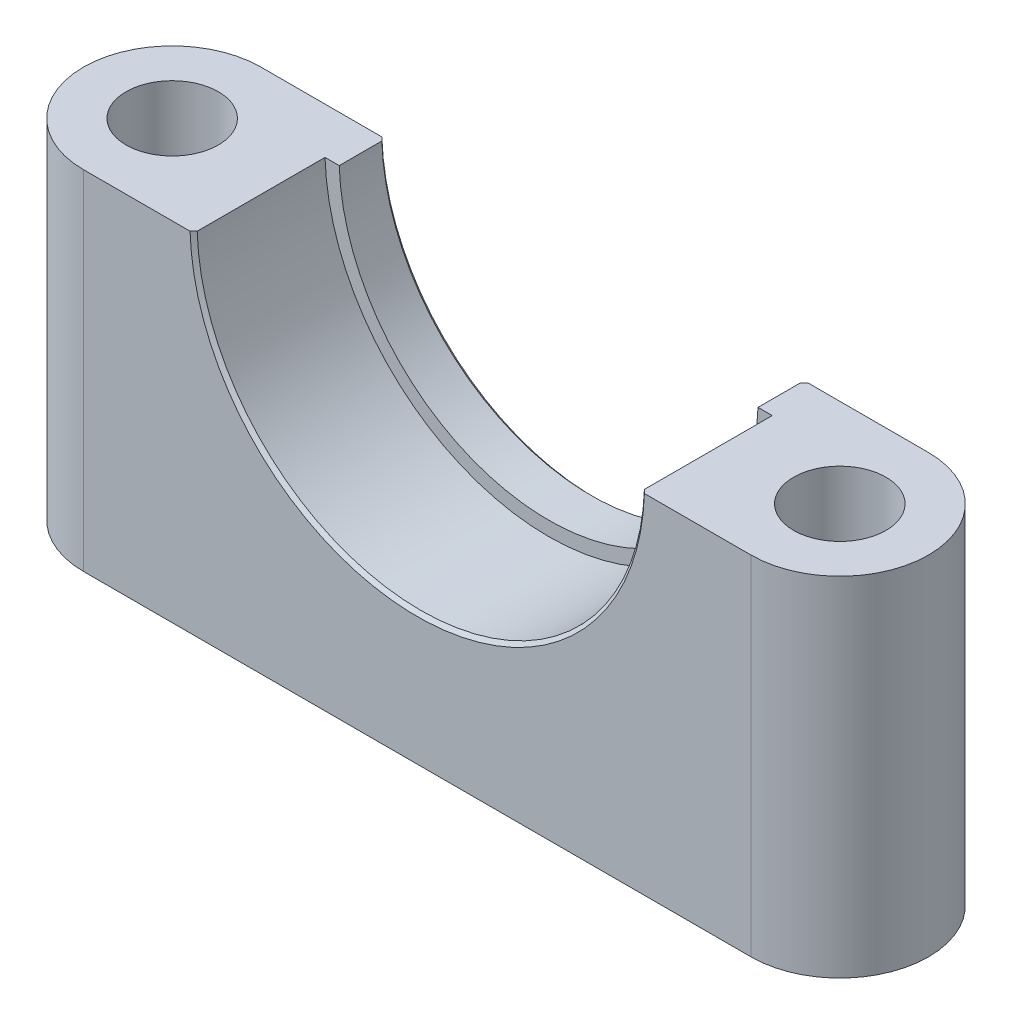
ISO-10303-21;
HEADER;
FILE_DESCRIPTION(('STEP AP214'),'2;1');
FILE_NAME('part.step','',(''),(''),'','','');
FILE_SCHEMA(('AUTOMOTIVE_DESIGN { 1 0 10303 214 1 1 1 1 }'));
ENDSEC;
DATA;
#1=APPLICATION_CONTEXT('core data for automotive mechanical design processes');
#2=APPLICATION_PROTOCOL_DEFINITION('international standard','automotive_design',2000,#1);
#3=PRODUCT_CONTEXT('',#1,'mechanical');
#4=PRODUCT('Part','Part','',(#3));
#5=PRODUCT_RELATED_PRODUCT_CATEGORY('part','',(#4));
#6=PRODUCT_DEFINITION_FORMATION('','',#4);
#7=PRODUCT_DEFINITION_CONTEXT('part definition',#1,'design');
#8=PRODUCT_DEFINITION('design','',#6,#7);
#9=PRODUCT_DEFINITION_SHAPE('','',#8);
#10=(LENGTH_UNIT() NAMED_UNIT(*) SI_UNIT(.MILLI.,.METRE.));
#11=(NAMED_UNIT(*) PLANE_ANGLE_UNIT() SI_UNIT($,.RADIAN.));
#12=(NAMED_UNIT(*) SI_UNIT($,.STERADIAN.) SOLID_ANGLE_UNIT());
#13=UNCERTAINTY_MEASURE_WITH_UNIT(LENGTH_MEASURE(1.E-05),#10,'distance_accuracy_value','');
#14=(GEOMETRIC_REPRESENTATION_CONTEXT(3) GLOBAL_UNCERTAINTY_ASSIGNED_CONTEXT((#13)) GLOBAL_UNIT_ASSIGNED_CONTEXT((#10,
#11,#12)) REPRESENTATION_CONTEXT('',''));
#15=CARTESIAN_POINT('',(0.,0.,0.));
#16=DIRECTION('',(0.,0.,1.));
#17=DIRECTION('',(1.,0.,0.));
#18=AXIS2_PLACEMENT_3D('',#15,#16,#17);
#19=CARTESIAN_POINT('',(-23.876,24.892,0.));
#20=DIRECTION('',(0.,1.,0.));
#21=DIRECTION('',(0.,0.,1.));
#22=AXIS2_PLACEMENT_3D('',#19,#20,#21);
#23=PLANE('',#22);
#24=DIRECTION('',(0.,0.,1.));
#25=VECTOR('',#24,1.);
#26=CARTESIAN_POINT('',(-14.9773873556105,24.892,-20.828));
#27=LINE('',#26,#25);
#28=CARTESIAN_POINT('',(-14.9773873556105,24.892,-6.09600000000004));
#29=VERTEX_POINT('',#28);
#30=CARTESIAN_POINT('',(-14.9773873556105,24.892,-3.048));
#31=VERTEX_POINT('',#30);
#32=EDGE_CURVE('E120',#29,#31,#27,.T.);
#33=ORIENTED_EDGE('',*,*,#32,.F.);
#34=CARTESIAN_POINT('',(-14.9773873556105,24.892,-6.09600000000004));
#35=CARTESIAN_POINT('',(-15.0197448275827,24.892,-6.1383331320079));
#36=CARTESIAN_POINT('',(-15.0621021989492,24.892,-6.1806663646785));
#37=CARTESIAN_POINT('',(-15.1468167404703,24.892,-6.26533303134515));
#38=CARTESIAN_POINT('',(-15.1891739106251,24.892,-6.30766646534121));
#39=CARTESIAN_POINT('',(-15.231530980174,24.892,-6.35));
#40=B_SPLINE_CURVE_WITH_KNOTS('',3,(#34,#35,#36,#37,#38,#39),.UNSPECIFIED.,.F.,.F.,(4,2,4),(0.,
0.17965590854951,0.359311817099004),.UNSPECIFIED.);
#41=CARTESIAN_POINT('',(-15.231530980174,24.892,-6.35));
#42=VERTEX_POINT('',#41);
#43=EDGE_CURVE('E178',#29,#42,#40,.T.);
#44=ORIENTED_EDGE('',*,*,#43,.T.);
#45=DIRECTION('',(-1.,0.,0.));
#46=VECTOR('',#45,1.);
#47=CARTESIAN_POINT('',(-23.876,24.892,-6.35));
#48=LINE('',#47,#46);
#49=CARTESIAN_POINT('',(-23.876,24.892,-6.35));
#50=VERTEX_POINT('',#49);
#51=EDGE_CURVE('E242',#42,#50,#48,.T.);
#52=ORIENTED_EDGE('',*,*,#51,.T.);
#53=CARTESIAN_POINT('',(-23.876,24.892,0.));
#54=DIRECTION('',(0.,1.,0.));
#55=DIRECTION('',(0.,0.,1.));
#56=AXIS2_PLACEMENT_3D('',#53,#54,#55);
#57=CIRCLE('',#56,6.35);
#58=CARTESIAN_POINT('',(-23.876,24.892,6.35));
#59=VERTEX_POINT('',#58);
#60=EDGE_CURVE('E233',#50,#59,#57,.T.);
#61=ORIENTED_EDGE('',*,*,#60,.T.);
#62=DIRECTION('',(1.,0.,0.));
#63=VECTOR('',#62,1.);
#64=CARTESIAN_POINT('',(-23.876,24.892,6.35));
#65=LINE('',#64,#63);
#66=CARTESIAN_POINT('',(-16.248060561187,24.892,6.35));
#67=VERTEX_POINT('',#66);
#68=EDGE_CURVE('E238',#59,#67,#65,.T.);
#69=ORIENTED_EDGE('',*,*,#68,.T.);
#70=CARTESIAN_POINT('',(-16.248060561187,24.892,6.35));
#71=CARTESIAN_POINT('',(-16.2057063790463,24.892,6.3076665010764));
#72=CARTESIAN_POINT('',(-16.1633521141515,24.892,6.26533308494794));
#73=CARTESIAN_POINT('',(-16.0786434188539,24.892,6.18066641828127));
#74=CARTESIAN_POINT('',(-16.036288988451,24.892,6.13833316774306));
#75=CARTESIAN_POINT('',(-15.9939344752941,24.892,6.09599999999998));
#76=B_SPLINE_CURVE_WITH_KNOTS('',3,(#70,#71,#72,#73,#74,#75),.UNSPECIFIED.,.F.,.F.,(4,2,4),(0.,
0.179649706047461,0.359299412094932),.UNSPECIFIED.);
#77=CARTESIAN_POINT('',(-15.9939344752941,24.892,6.09599999999998));
#78=VERTEX_POINT('',#77);
#79=EDGE_CURVE('E52',#67,#78,#76,.T.);
#80=ORIENTED_EDGE('',*,*,#79,.T.);
#81=DIRECTION('',(0.,0.,1.));
#82=VECTOR('',#81,1.);
#83=CARTESIAN_POINT('',(-15.9939344752941,24.892,-51.6104908501885));
#84=LINE('',#83,#82);
#85=CARTESIAN_POINT('',(-15.9939344752941,24.892,-3.04800000000001));
#86=VERTEX_POINT('',#85);
#87=EDGE_CURVE('E225',#86,#78,#84,.T.);
#88=ORIENTED_EDGE('',*,*,#87,.F.);
#89=DIRECTION('',(1.,0.,0.));
#90=VECTOR('',#89,1.);
#91=CARTESIAN_POINT('',(-23.876,24.892,-3.048));
#92=LINE('',#91,#90);
#93=EDGE_CURVE('E138',#86,#31,#92,.T.);
#94=ORIENTED_EDGE('',*,*,#93,.T.);
#95=EDGE_LOOP('',(#33,#44,#52,#61,#69,#80,#88,#94));
#96=FACE_BOUND('',#95,.T.);
#97=CARTESIAN_POINT('',(-23.876,24.892,0.));
#98=DIRECTION('',(0.,1.,0.));
#99=DIRECTION('',(0.,0.,1.));
#100=AXIS2_PLACEMENT_3D('',#97,#98,#99);
#101=CIRCLE('',#100,3.302);
#102=CARTESIAN_POINT('',(-23.876,24.892,3.302));
#103=VERTEX_POINT('',#102);
#104=EDGE_CURVE('E216',#103,#103,#101,.T.);
#105=ORIENTED_EDGE('',*,*,#104,.F.);
#106=EDGE_LOOP('',(#105));
#107=FACE_BOUND('',#106,.T.);
#108=ADVANCED_FACE('F36',(#96,#107),#23,.T.);
#109=CARTESIAN_POINT('',(23.876,24.892,-6.35000000000001));
#110=VERTEX_POINT('',#109);
#111=CARTESIAN_POINT('',(15.231530980174,24.892,-6.35000000000001));
#112=VERTEX_POINT('',#111);
#113=EDGE_CURVE('E243',#110,#112,#48,.T.);
#114=ORIENTED_EDGE('',*,*,#113,.T.);
#115=CARTESIAN_POINT('',(15.231530980174,24.892,-6.35000000000001));
#116=CARTESIAN_POINT('',(15.1891739106251,24.892,-6.30766646534121));
#117=CARTESIAN_POINT('',(15.1468167404703,24.892,-6.26533303134515));
#118=CARTESIAN_POINT('',(15.0621021989492,24.892,-6.1806663646785));
#119=CARTESIAN_POINT('',(15.0197448275827,24.892,-6.1383331320079));
#120=CARTESIAN_POINT('',(14.9773873556105,24.892,-6.09600000000004));
#121=B_SPLINE_CURVE_WITH_KNOTS('',3,(#115,#116,#117,#118,#119,#120),.UNSPECIFIED.,.F.,.F.,(4,2,
4),(0.,0.179655908549496,0.359311817099008),.UNSPECIFIED.);
#122=CARTESIAN_POINT('',(14.9773873556105,24.892,-6.09600000000004));
#123=VERTEX_POINT('',#122);
#124=EDGE_CURVE('E133',#112,#123,#121,.T.);
#125=ORIENTED_EDGE('',*,*,#124,.T.);
#126=DIRECTION('',(0.,0.,1.));
#127=VECTOR('',#126,1.);
#128=CARTESIAN_POINT('',(14.9773873556105,24.892,-20.828));
#129=LINE('',#128,#127);
#130=CARTESIAN_POINT('',(14.9773873556105,24.892,-3.048));
#131=VERTEX_POINT('',#130);
#132=EDGE_CURVE('E117',#131,#123,#129,.F.);
#133=ORIENTED_EDGE('',*,*,#132,.F.);
#134=CARTESIAN_POINT('',(15.9939344752941,24.892,-3.04800000000001));
#135=VERTEX_POINT('',#134);
#136=EDGE_CURVE('E131',#131,#135,#92,.T.);
#137=ORIENTED_EDGE('',*,*,#136,.T.);
#138=DIRECTION('',(0.,0.,1.));
#139=VECTOR('',#138,1.);
#140=CARTESIAN_POINT('',(15.9939344752941,24.892,-51.6104908501885));
#141=LINE('',#140,#139);
#142=CARTESIAN_POINT('',(15.9939344752941,24.892,6.09599999999998));
#143=VERTEX_POINT('',#142);
#144=EDGE_CURVE('E276',#143,#135,#141,.F.);
#145=ORIENTED_EDGE('',*,*,#144,.F.);
#146=CARTESIAN_POINT('',(15.9939344752941,24.892,6.09599999999998));
#147=CARTESIAN_POINT('',(16.036288988451,24.892,6.13833316774306));
#148=CARTESIAN_POINT('',(16.0786434188539,24.892,6.18066641828127));
#149=CARTESIAN_POINT('',(16.1633521141515,24.892,6.26533308494794));
#150=CARTESIAN_POINT('',(16.2057063790463,24.892,6.3076665010764));
#151=CARTESIAN_POINT('',(16.248060561187,24.892,6.35));
#152=B_SPLINE_CURVE_WITH_KNOTS('',3,(#146,#147,#148,#149,#150,#151),.UNSPECIFIED.,.F.,.F.,(4,2,
4),(0.,0.179649706047471,0.359299412094929),.UNSPECIFIED.);
#153=CARTESIAN_POINT('',(16.248060561187,24.892,6.34999999999999));
#154=VERTEX_POINT('',#153);
#155=EDGE_CURVE('E149',#143,#154,#152,.T.);
#156=ORIENTED_EDGE('',*,*,#155,.T.);
#157=CARTESIAN_POINT('',(23.876,24.892,6.35));
#158=VERTEX_POINT('',#157);
#159=EDGE_CURVE('E236',#154,#158,#65,.T.);
#160=ORIENTED_EDGE('',*,*,#159,.T.);
#161=CARTESIAN_POINT('',(23.876,24.892,0.));
#162=DIRECTION('',(0.,1.,0.));
#163=DIRECTION('',(0.,0.,1.));
#164=AXIS2_PLACEMENT_3D('',#161,#162,#163);
#165=CIRCLE('',#164,6.35);
#166=EDGE_CURVE('E240',#158,#110,#165,.T.);
#167=ORIENTED_EDGE('',*,*,#166,.T.);
#168=EDGE_LOOP('',(#114,#125,#133,#137,#145,#156,#160,#167));
#169=FACE_BOUND('',#168,.T.);
#170=CARTESIAN_POINT('',(23.876,24.892,0.));
#171=DIRECTION('',(0.,1.,0.));
#172=DIRECTION('',(0.,0.,1.));
#173=AXIS2_PLACEMENT_3D('',#170,#171,#172);
#174=CIRCLE('',#173,3.302);
#175=CARTESIAN_POINT('',(23.876,24.892,3.302));
#176=VERTEX_POINT('',#175);
#177=EDGE_CURVE('E222',#176,#176,#174,.T.);
#178=ORIENTED_EDGE('',*,*,#177,.F.);
#179=EDGE_LOOP('',(#178));
#180=FACE_BOUND('',#179,.T.);
#181=ADVANCED_FACE('F128',(#169,#180),#23,.T.);
#182=CARTESIAN_POINT('',(-23.876,0.,0.));
#183=DIRECTION('',(0.,1.,0.));
#184=DIRECTION('',(0.,0.,1.));
#185=AXIS2_PLACEMENT_3D('',#182,#183,#184);
#186=PLANE('',#185);
#187=CARTESIAN_POINT('',(-23.876,0.,0.));
#188=DIRECTION('',(0.,1.,0.));
#189=DIRECTION('',(0.,0.,1.));
#190=AXIS2_PLACEMENT_3D('',#187,#188,#189);
#191=CIRCLE('',#190,6.35);
#192=CARTESIAN_POINT('',(-23.876,0.,-6.35));
#193=VERTEX_POINT('',#192);
#194=CARTESIAN_POINT('',(-23.876,0.,6.35));
#195=VERTEX_POINT('',#194);
#196=EDGE_CURVE('E231',#193,#195,#191,.T.);
#197=ORIENTED_EDGE('',*,*,#196,.F.);
#198=DIRECTION('',(-1.,0.,0.));
#199=VECTOR('',#198,1.);
#200=CARTESIAN_POINT('',(-23.876,0.,-6.35));
#201=LINE('',#200,#199);
#202=CARTESIAN_POINT('',(23.876,0.,-6.35000000000001));
#203=VERTEX_POINT('',#202);
#204=EDGE_CURVE('E237',#203,#193,#201,.T.);
#205=ORIENTED_EDGE('',*,*,#204,.F.);
#206=CARTESIAN_POINT('',(23.876,0.,0.));
#207=DIRECTION('',(0.,1.,0.));
#208=DIRECTION('',(0.,0.,1.));
#209=AXIS2_PLACEMENT_3D('',#206,#207,#208);
#210=CIRCLE('',#209,6.35);
#211=CARTESIAN_POINT('',(23.876,0.,6.35));
#212=VERTEX_POINT('',#211);
#213=EDGE_CURVE('E250',#212,#203,#210,.T.);
#214=ORIENTED_EDGE('',*,*,#213,.F.);
#215=DIRECTION('',(1.,0.,0.));
#216=VECTOR('',#215,1.);
#217=CARTESIAN_POINT('',(-23.876,0.,6.35));
#218=LINE('',#217,#216);
#219=EDGE_CURVE('E248',#195,#212,#218,.T.);
#220=ORIENTED_EDGE('',*,*,#219,.F.);
#221=EDGE_LOOP('',(#197,#205,#214,#220));
#222=FACE_BOUND('',#221,.T.);
#223=CARTESIAN_POINT('',(23.876,0.,0.));
#224=DIRECTION('',(0.,1.,0.));
#225=DIRECTION('',(0.,0.,1.));
#226=AXIS2_PLACEMENT_3D('',#223,#224,#225);
#227=CIRCLE('',#226,3.302);
#228=CARTESIAN_POINT('',(23.876,0.,3.302));
#229=VERTEX_POINT('',#228);
#230=EDGE_CURVE('E218',#229,#229,#227,.T.);
#231=ORIENTED_EDGE('',*,*,#230,.T.);
#232=EDGE_LOOP('',(#231));
#233=FACE_BOUND('',#232,.T.);
#234=CARTESIAN_POINT('',(-23.876,0.,0.));
#235=DIRECTION('',(0.,1.,0.));
#236=DIRECTION('',(0.,0.,1.));
#237=AXIS2_PLACEMENT_3D('',#234,#235,#236);
#238=CIRCLE('',#237,3.302);
#239=CARTESIAN_POINT('',(-23.876,0.,3.302));
#240=VERTEX_POINT('',#239);
#241=EDGE_CURVE('E219',#240,#240,#238,.T.);
#242=ORIENTED_EDGE('',*,*,#241,.T.);
#243=EDGE_LOOP('',(#242));
#244=FACE_BOUND('',#243,.T.);
#245=ADVANCED_FACE('F165',(#222,#233,#244),#186,.F.);
#246=CARTESIAN_POINT('',(-23.876,24.892,0.));
#247=DIRECTION('',(0.,-1.,0.));
#248=DIRECTION('',(0.,0.,-1.));
#249=AXIS2_PLACEMENT_3D('',#246,#247,#248);
#250=CYLINDRICAL_SURFACE('',#249,6.35);
#251=ORIENTED_EDGE('',*,*,#196,.T.);
#252=DIRECTION('',(0.,-1.,0.));
#253=VECTOR('',#252,1.);
#254=CARTESIAN_POINT('',(-23.876,24.892,6.35));
#255=LINE('',#254,#253);
#256=EDGE_CURVE('E139',#59,#195,#255,.T.);
#257=ORIENTED_EDGE('',*,*,#256,.F.);
#258=ORIENTED_EDGE('',*,*,#60,.F.);
#259=DIRECTION('',(0.,-1.,0.));
#260=VECTOR('',#259,1.);
#261=CARTESIAN_POINT('',(-23.876,24.892,-6.35));
#262=LINE('',#261,#260);
#263=EDGE_CURVE('E245',#50,#193,#262,.T.);
#264=ORIENTED_EDGE('',*,*,#263,.T.);
#265=EDGE_LOOP('',(#251,#257,#258,#264));
#266=FACE_BOUND('',#265,.T.);
#267=ADVANCED_FACE('F189',(#266),#250,.T.);
#268=CARTESIAN_POINT('',(-23.876,24.892,6.35));
#269=DIRECTION('',(0.,0.,-1.));
#270=DIRECTION('',(-1.,0.,0.));
#271=AXIS2_PLACEMENT_3D('',#268,#269,#270);
#272=PLANE('',#271);
#273=ORIENTED_EDGE('',*,*,#159,.F.);
#274=CARTESIAN_POINT('',(0.,25.4,6.35));
#275=DIRECTION('',(0.,0.,-1.));
#276=DIRECTION('',(-1.,0.,0.));
#277=AXIS2_PLACEMENT_3D('',#274,#275,#276);
#278=CIRCLE('',#277,16.256);
#279=EDGE_CURVE('E12',#154,#67,#278,.T.);
#280=ORIENTED_EDGE('',*,*,#279,.T.);
#281=ORIENTED_EDGE('',*,*,#68,.F.);
#282=ORIENTED_EDGE('',*,*,#256,.T.);
#283=ORIENTED_EDGE('',*,*,#219,.T.);
#284=DIRECTION('',(0.,-1.,0.));
#285=VECTOR('',#284,1.);
#286=CARTESIAN_POINT('',(23.876,24.892,6.35));
#287=LINE('',#286,#285);
#288=EDGE_CURVE('E143',#158,#212,#287,.T.);
#289=ORIENTED_EDGE('',*,*,#288,.F.);
#290=EDGE_LOOP('',(#273,#280,#281,#282,#283,#289));
#291=FACE_BOUND('',#290,.T.);
#292=ADVANCED_FACE('F193',(#291),#272,.F.);
#293=CARTESIAN_POINT('',(23.876,24.892,0.));
#294=DIRECTION('',(0.,-1.,0.));
#295=DIRECTION('',(0.,0.,-1.));
#296=AXIS2_PLACEMENT_3D('',#293,#294,#295);
#297=CYLINDRICAL_SURFACE('',#296,6.35);
#298=ORIENTED_EDGE('',*,*,#213,.T.);
#299=DIRECTION('',(0.,-1.,0.));
#300=VECTOR('',#299,1.);
#301=CARTESIAN_POINT('',(23.876,24.892,-6.35000000000001));
#302=LINE('',#301,#300);
#303=EDGE_CURVE('E255',#110,#203,#302,.T.);
#304=ORIENTED_EDGE('',*,*,#303,.F.);
#305=ORIENTED_EDGE('',*,*,#166,.F.);
#306=ORIENTED_EDGE('',*,*,#288,.T.);
#307=EDGE_LOOP('',(#298,#304,#305,#306));
#308=FACE_BOUND('',#307,.T.);
#309=ADVANCED_FACE('F197',(#308),#297,.T.);
#310=CARTESIAN_POINT('',(-23.876,24.892,-6.35));
#311=DIRECTION('',(0.,0.,1.));
#312=DIRECTION('',(1.,0.,0.));
#313=AXIS2_PLACEMENT_3D('',#310,#311,#312);
#314=PLANE('',#313);
#315=ORIENTED_EDGE('',*,*,#51,.F.);
#316=CARTESIAN_POINT('',(0.,25.4,-6.35));
#317=DIRECTION('',(0.,0.,1.));
#318=DIRECTION('',(1.,0.,0.));
#319=AXIS2_PLACEMENT_3D('',#316,#317,#318);
#320=CIRCLE('',#319,15.24);
#321=EDGE_CURVE('E141',#42,#112,#320,.T.);
#322=ORIENTED_EDGE('',*,*,#321,.T.);
#323=ORIENTED_EDGE('',*,*,#113,.F.);
#324=ORIENTED_EDGE('',*,*,#303,.T.);
#325=ORIENTED_EDGE('',*,*,#204,.T.);
#326=ORIENTED_EDGE('',*,*,#263,.F.);
#327=EDGE_LOOP('',(#315,#322,#323,#324,#325,#326));
#328=FACE_BOUND('',#327,.T.);
#329=ADVANCED_FACE('F199',(#328),#314,.F.);
#330=CARTESIAN_POINT('',(23.876,24.892,0.));
#331=DIRECTION('',(0.,-1.,0.));
#332=DIRECTION('',(0.,0.,-1.));
#333=AXIS2_PLACEMENT_3D('',#330,#331,#332);
#334=CYLINDRICAL_SURFACE('',#333,3.302);
#335=ORIENTED_EDGE('',*,*,#177,.T.);
#336=EDGE_LOOP('',(#335));
#337=FACE_BOUND('',#336,.T.);
#338=ORIENTED_EDGE('',*,*,#230,.F.);
#339=EDGE_LOOP('',(#338));
#340=FACE_BOUND('',#339,.T.);
#341=ADVANCED_FACE('F166',(#337,#340),#334,.F.);
#342=CARTESIAN_POINT('',(-23.876,24.892,0.));
#343=DIRECTION('',(0.,-1.,0.));
#344=DIRECTION('',(0.,0.,-1.));
#345=AXIS2_PLACEMENT_3D('',#342,#343,#344);
#346=CYLINDRICAL_SURFACE('',#345,3.302);
#347=ORIENTED_EDGE('',*,*,#104,.T.);
#348=EDGE_LOOP('',(#347));
#349=FACE_BOUND('',#348,.T.);
#350=ORIENTED_EDGE('',*,*,#241,.F.);
#351=EDGE_LOOP('',(#350));
#352=FACE_BOUND('',#351,.T.);
#353=ADVANCED_FACE('F206',(#349,#352),#346,.F.);
#354=CARTESIAN_POINT('',(0.,25.4,-51.6104908501885));
#355=DIRECTION('',(0.,0.,1.));
#356=DIRECTION('',(1.,0.,0.));
#357=AXIS2_PLACEMENT_3D('',#354,#355,#356);
#358=CYLINDRICAL_SURFACE('',#357,16.002);
#359=ORIENTED_EDGE('',*,*,#87,.T.);
#360=CARTESIAN_POINT('',(0.,25.4,6.09599999999998));
#361=DIRECTION('',(0.,0.,-1.));
#362=DIRECTION('',(-1.,0.,0.));
#363=AXIS2_PLACEMENT_3D('',#360,#361,#362);
#364=CIRCLE('',#363,16.002);
#365=EDGE_CURVE('E45',#78,#143,#364,.F.);
#366=ORIENTED_EDGE('',*,*,#365,.T.);
#367=ORIENTED_EDGE('',*,*,#144,.T.);
#368=CARTESIAN_POINT('',(0.,25.4,-3.04800000000001));
#369=DIRECTION('',(0.,0.,1.));
#370=DIRECTION('',(1.,0.,0.));
#371=AXIS2_PLACEMENT_3D('',#368,#369,#370);
#372=CIRCLE('',#371,16.002);
#373=EDGE_CURVE('E137',#135,#86,#372,.F.);
#374=ORIENTED_EDGE('',*,*,#373,.T.);
#375=EDGE_LOOP('',(#359,#366,#367,#374));
#376=FACE_BOUND('',#375,.T.);
#377=ADVANCED_FACE('F275',(#376),#358,.F.);
#378=CARTESIAN_POINT('',(-23.876,24.892,-3.048));
#379=DIRECTION('',(0.,0.,1.));
#380=DIRECTION('',(1.,0.,0.));
#381=AXIS2_PLACEMENT_3D('',#378,#379,#380);
#382=PLANE('',#381);
#383=CARTESIAN_POINT('',(0.,25.4,-3.048));
#384=DIRECTION('',(0.,0.,1.));
#385=DIRECTION('',(1.,0.,0.));
#386=AXIS2_PLACEMENT_3D('',#383,#384,#385);
#387=CIRCLE('',#386,14.986);
#388=EDGE_CURVE('E114',#31,#131,#387,.T.);
#389=ORIENTED_EDGE('',*,*,#388,.F.);
#390=ORIENTED_EDGE('',*,*,#93,.F.);
#391=ORIENTED_EDGE('',*,*,#373,.F.);
#392=ORIENTED_EDGE('',*,*,#136,.F.);
#393=EDGE_LOOP('',(#389,#390,#391,#392));
#394=FACE_BOUND('',#393,.T.);
#395=ADVANCED_FACE('F135',(#394),#382,.T.);
#396=CARTESIAN_POINT('',(0.,25.4,-20.828));
#397=DIRECTION('',(0.,0.,1.));
#398=DIRECTION('',(1.,0.,0.));
#399=AXIS2_PLACEMENT_3D('',#396,#397,#398);
#400=CYLINDRICAL_SURFACE('',#399,14.986);
#401=ORIENTED_EDGE('',*,*,#132,.T.);
#402=CARTESIAN_POINT('',(0.,25.4,-6.09600000000004));
#403=DIRECTION('',(0.,0.,1.));
#404=DIRECTION('',(1.,0.,0.));
#405=AXIS2_PLACEMENT_3D('',#402,#403,#404);
#406=CIRCLE('',#405,14.986);
#407=EDGE_CURVE('E179',#123,#29,#406,.F.);
#408=ORIENTED_EDGE('',*,*,#407,.T.);
#409=ORIENTED_EDGE('',*,*,#32,.T.);
#410=ORIENTED_EDGE('',*,*,#388,.T.);
#411=EDGE_LOOP('',(#401,#408,#409,#410));
#412=FACE_BOUND('',#411,.T.);
#413=ADVANCED_FACE('F116',(#412),#400,.F.);
#414=CARTESIAN_POINT('',(0.,25.4,-6.35));
#415=DIRECTION('',(0.,0.,-1.));
#416=DIRECTION('',(-1.,0.,0.));
#417=AXIS2_PLACEMENT_3D('',#414,#415,#416);
#418=CONICAL_SURFACE('',#417,15.24,0.785398163397455);
#419=ORIENTED_EDGE('',*,*,#43,.F.);
#420=ORIENTED_EDGE('',*,*,#407,.F.);
#421=ORIENTED_EDGE('',*,*,#124,.F.);
#422=ORIENTED_EDGE('',*,*,#321,.F.);
#423=EDGE_LOOP('',(#419,#420,#421,#422));
#424=FACE_BOUND('',#423,.T.);
#425=ADVANCED_FACE('F184',(#424),#418,.F.);
#426=CARTESIAN_POINT('',(0.,25.4,6.09599999999998));
#427=DIRECTION('',(0.,0.,1.));
#428=DIRECTION('',(1.,0.,0.));
#429=AXIS2_PLACEMENT_3D('',#426,#427,#428);
#430=CONICAL_SURFACE('',#429,16.002,0.785398163397414);
#431=ORIENTED_EDGE('',*,*,#79,.F.);
#432=ORIENTED_EDGE('',*,*,#279,.F.);
#433=ORIENTED_EDGE('',*,*,#155,.F.);
#434=ORIENTED_EDGE('',*,*,#365,.F.);
#435=EDGE_LOOP('',(#431,#432,#433,#434));
#436=FACE_BOUND('',#435,.T.);
#437=ADVANCED_FACE('F38',(#436),#430,.F.);
#438=CLOSED_SHELL('',(#108,#181,#245,#267,#292,#309,#329,#341,#353,#377,#395,#413,#425,#437));
#439=MANIFOLD_SOLID_BREP('B2',#438);
#440=ADVANCED_BREP_SHAPE_REPRESENTATION('',(#18,#439),#14);
#441=SHAPE_DEFINITION_REPRESENTATION(#9,#440);
ENDSEC;
END-ISO-10303-21;
